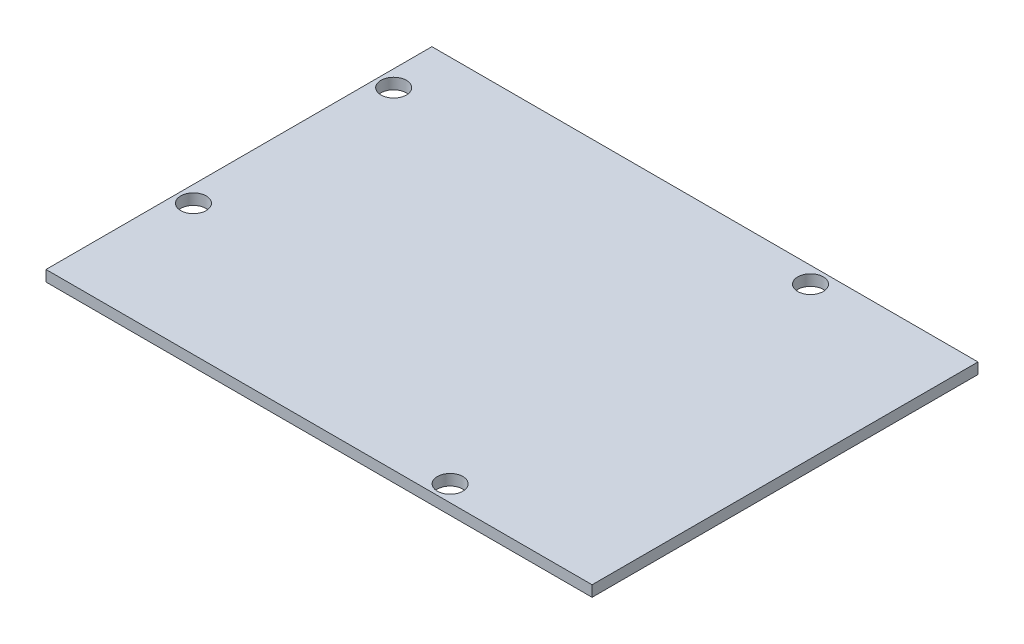
ISO-10303-21;
HEADER;
FILE_DESCRIPTION(('STEP AP214'),'2;1');
FILE_NAME('part.step','',(''),(''),'','','');
FILE_SCHEMA(('AUTOMOTIVE_DESIGN { 1 0 10303 214 1 1 1 1 }'));
ENDSEC;
DATA;
#1=APPLICATION_CONTEXT('core data for automotive mechanical design processes');
#2=APPLICATION_PROTOCOL_DEFINITION('international standard','automotive_design',2000,#1);
#3=PRODUCT_CONTEXT('',#1,'mechanical');
#4=PRODUCT('Part','Part','',(#3));
#5=PRODUCT_RELATED_PRODUCT_CATEGORY('part','',(#4));
#6=PRODUCT_DEFINITION_FORMATION('','',#4);
#7=PRODUCT_DEFINITION_CONTEXT('part definition',#1,'design');
#8=PRODUCT_DEFINITION('design','',#6,#7);
#9=PRODUCT_DEFINITION_SHAPE('','',#8);
#10=(LENGTH_UNIT() NAMED_UNIT(*) SI_UNIT(.MILLI.,.METRE.));
#11=(NAMED_UNIT(*) PLANE_ANGLE_UNIT() SI_UNIT($,.RADIAN.));
#12=(NAMED_UNIT(*) SI_UNIT($,.STERADIAN.) SOLID_ANGLE_UNIT());
#13=UNCERTAINTY_MEASURE_WITH_UNIT(LENGTH_MEASURE(1.E-05),#10,'distance_accuracy_value','');
#14=(GEOMETRIC_REPRESENTATION_CONTEXT(3) GLOBAL_UNCERTAINTY_ASSIGNED_CONTEXT((#13)) GLOBAL_UNIT_ASSIGNED_CONTEXT((#10,
#11,#12)) REPRESENTATION_CONTEXT('',''));
#15=CARTESIAN_POINT('',(0.,0.,0.));
#16=DIRECTION('',(0.,0.,1.));
#17=DIRECTION('',(1.,0.,0.));
#18=AXIS2_PLACEMENT_3D('',#15,#16,#17);
#19=CARTESIAN_POINT('',(0.,1.5,0.));
#20=DIRECTION('',(0.,1.,0.));
#21=DIRECTION('',(0.,0.,1.));
#22=AXIS2_PLACEMENT_3D('',#19,#20,#21);
#23=PLANE('',#22);
#24=CARTESIAN_POINT('',(15.75,1.5,24.25));
#25=DIRECTION('',(0.,1.,0.));
#26=DIRECTION('',(0.,0.,1.));
#27=AXIS2_PLACEMENT_3D('',#24,#25,#26);
#28=CIRCLE('',#27,1.75);
#29=CARTESIAN_POINT('',(15.75,1.5,26.));
#30=VERTEX_POINT('',#29);
#31=EDGE_CURVE('E127',#30,#30,#28,.T.);
#32=ORIENTED_EDGE('',*,*,#31,.F.);
#33=EDGE_LOOP('',(#32));
#34=FACE_BOUND('',#33,.T.);
#35=CARTESIAN_POINT('',(-35.25,1.5,-19.));
#36=DIRECTION('',(0.,1.,0.));
#37=DIRECTION('',(0.,0.,1.));
#38=AXIS2_PLACEMENT_3D('',#35,#36,#37);
#39=CIRCLE('',#38,1.75);
#40=CARTESIAN_POINT('',(-35.25,1.5,-17.25));
#41=VERTEX_POINT('',#40);
#42=EDGE_CURVE('E106',#41,#41,#39,.T.);
#43=ORIENTED_EDGE('',*,*,#42,.F.);
#44=EDGE_LOOP('',(#43));
#45=FACE_BOUND('',#44,.T.);
#46=DIRECTION('',(0.,0.,1.));
#47=VECTOR('',#46,1.);
#48=CARTESIAN_POINT('',(-37.5,1.5,26.5));
#49=LINE('',#48,#47);
#50=CARTESIAN_POINT('',(-37.5,1.5,-26.5));
#51=VERTEX_POINT('',#50);
#52=CARTESIAN_POINT('',(-37.5,1.5,26.5));
#53=VERTEX_POINT('',#52);
#54=EDGE_CURVE('E91',#51,#53,#49,.T.);
#55=ORIENTED_EDGE('',*,*,#54,.T.);
#56=DIRECTION('',(1.,0.,0.));
#57=VECTOR('',#56,1.);
#58=CARTESIAN_POINT('',(37.5,1.5,26.5));
#59=LINE('',#58,#57);
#60=CARTESIAN_POINT('',(37.5,1.5,26.5));
#61=VERTEX_POINT('',#60);
#62=EDGE_CURVE('E86',#53,#61,#59,.T.);
#63=ORIENTED_EDGE('',*,*,#62,.T.);
#64=DIRECTION('',(0.,0.,-1.));
#65=VECTOR('',#64,1.);
#66=CARTESIAN_POINT('',(37.5,1.5,26.5));
#67=LINE('',#66,#65);
#68=CARTESIAN_POINT('',(37.5,1.5,-26.5));
#69=VERTEX_POINT('',#68);
#70=EDGE_CURVE('E89',#61,#69,#67,.T.);
#71=ORIENTED_EDGE('',*,*,#70,.T.);
#72=DIRECTION('',(-1.,0.,0.));
#73=VECTOR('',#72,1.);
#74=CARTESIAN_POINT('',(37.5,1.5,-26.5));
#75=LINE('',#74,#73);
#76=EDGE_CURVE('E56',#69,#51,#75,.T.);
#77=ORIENTED_EDGE('',*,*,#76,.T.);
#78=EDGE_LOOP('',(#55,#63,#71,#77));
#79=FACE_BOUND('',#78,.T.);
#80=CARTESIAN_POINT('',(-35.25,1.5,8.50000000000001));
#81=DIRECTION('',(0.,1.,0.));
#82=DIRECTION('',(0.,0.,1.));
#83=AXIS2_PLACEMENT_3D('',#80,#81,#82);
#84=CIRCLE('',#83,1.75);
#85=CARTESIAN_POINT('',(-35.25,1.5,10.25));
#86=VERTEX_POINT('',#85);
#87=EDGE_CURVE('E121',#86,#86,#84,.T.);
#88=ORIENTED_EDGE('',*,*,#87,.F.);
#89=EDGE_LOOP('',(#88));
#90=FACE_BOUND('',#89,.T.);
#91=CARTESIAN_POINT('',(16.75,1.5,-24.25));
#92=DIRECTION('',(0.,1.,0.));
#93=DIRECTION('',(0.,0.,1.));
#94=AXIS2_PLACEMENT_3D('',#91,#92,#93);
#95=CIRCLE('',#94,1.75);
#96=CARTESIAN_POINT('',(16.75,1.5,-22.5));
#97=VERTEX_POINT('',#96);
#98=EDGE_CURVE('E133',#97,#97,#95,.T.);
#99=ORIENTED_EDGE('',*,*,#98,.F.);
#100=EDGE_LOOP('',(#99));
#101=FACE_BOUND('',#100,.T.);
#102=ADVANCED_FACE('F39',(#34,#45,#79,#90,#101),#23,.T.);
#103=CARTESIAN_POINT('',(0.,0.,0.));
#104=DIRECTION('',(0.,1.,0.));
#105=DIRECTION('',(0.,0.,1.));
#106=AXIS2_PLACEMENT_3D('',#103,#104,#105);
#107=PLANE('',#106);
#108=DIRECTION('',(0.,0.,1.));
#109=VECTOR('',#108,1.);
#110=CARTESIAN_POINT('',(-37.5,0.,26.5));
#111=LINE('',#110,#109);
#112=CARTESIAN_POINT('',(-37.5,0.,-26.5));
#113=VERTEX_POINT('',#112);
#114=CARTESIAN_POINT('',(-37.5,0.,26.5));
#115=VERTEX_POINT('',#114);
#116=EDGE_CURVE('E103',#113,#115,#111,.T.);
#117=ORIENTED_EDGE('',*,*,#116,.F.);
#118=DIRECTION('',(-1.,0.,0.));
#119=VECTOR('',#118,1.);
#120=CARTESIAN_POINT('',(37.5,0.,-26.5));
#121=LINE('',#120,#119);
#122=CARTESIAN_POINT('',(37.5,0.,-26.5));
#123=VERTEX_POINT('',#122);
#124=EDGE_CURVE('E79',#123,#113,#121,.T.);
#125=ORIENTED_EDGE('',*,*,#124,.F.);
#126=DIRECTION('',(0.,0.,-1.));
#127=VECTOR('',#126,1.);
#128=CARTESIAN_POINT('',(37.5,0.,26.5));
#129=LINE('',#128,#127);
#130=CARTESIAN_POINT('',(37.5,0.,26.5));
#131=VERTEX_POINT('',#130);
#132=EDGE_CURVE('E73',#131,#123,#129,.T.);
#133=ORIENTED_EDGE('',*,*,#132,.F.);
#134=DIRECTION('',(1.,0.,0.));
#135=VECTOR('',#134,1.);
#136=CARTESIAN_POINT('',(37.5,0.,26.5));
#137=LINE('',#136,#135);
#138=EDGE_CURVE('E95',#115,#131,#137,.T.);
#139=ORIENTED_EDGE('',*,*,#138,.F.);
#140=EDGE_LOOP('',(#117,#125,#133,#139));
#141=FACE_BOUND('',#140,.T.);
#142=CARTESIAN_POINT('',(-35.25,0.,-19.));
#143=DIRECTION('',(0.,1.,0.));
#144=DIRECTION('',(0.,0.,1.));
#145=AXIS2_PLACEMENT_3D('',#142,#143,#144);
#146=CIRCLE('',#145,1.75);
#147=CARTESIAN_POINT('',(-35.25,0.,-17.25));
#148=VERTEX_POINT('',#147);
#149=EDGE_CURVE('E118',#148,#148,#146,.T.);
#150=ORIENTED_EDGE('',*,*,#149,.T.);
#151=EDGE_LOOP('',(#150));
#152=FACE_BOUND('',#151,.T.);
#153=CARTESIAN_POINT('',(-35.25,0.,8.50000000000001));
#154=DIRECTION('',(0.,1.,0.));
#155=DIRECTION('',(0.,0.,1.));
#156=AXIS2_PLACEMENT_3D('',#153,#154,#155);
#157=CIRCLE('',#156,1.75);
#158=CARTESIAN_POINT('',(-35.25,0.,10.25));
#159=VERTEX_POINT('',#158);
#160=EDGE_CURVE('E124',#159,#159,#157,.T.);
#161=ORIENTED_EDGE('',*,*,#160,.T.);
#162=EDGE_LOOP('',(#161));
#163=FACE_BOUND('',#162,.T.);
#164=CARTESIAN_POINT('',(15.75,0.,24.25));
#165=DIRECTION('',(0.,1.,0.));
#166=DIRECTION('',(0.,0.,1.));
#167=AXIS2_PLACEMENT_3D('',#164,#165,#166);
#168=CIRCLE('',#167,1.75);
#169=CARTESIAN_POINT('',(15.75,0.,26.));
#170=VERTEX_POINT('',#169);
#171=EDGE_CURVE('E130',#170,#170,#168,.T.);
#172=ORIENTED_EDGE('',*,*,#171,.T.);
#173=EDGE_LOOP('',(#172));
#174=FACE_BOUND('',#173,.T.);
#175=CARTESIAN_POINT('',(16.75,0.,-24.25));
#176=DIRECTION('',(0.,1.,0.));
#177=DIRECTION('',(0.,0.,1.));
#178=AXIS2_PLACEMENT_3D('',#175,#176,#177);
#179=CIRCLE('',#178,1.75);
#180=CARTESIAN_POINT('',(16.75,0.,-22.5));
#181=VERTEX_POINT('',#180);
#182=EDGE_CURVE('E136',#181,#181,#179,.T.);
#183=ORIENTED_EDGE('',*,*,#182,.T.);
#184=EDGE_LOOP('',(#183));
#185=FACE_BOUND('',#184,.T.);
#186=ADVANCED_FACE('F114',(#141,#152,#163,#174,#185),#107,.F.);
#187=CARTESIAN_POINT('',(-37.5,1.5,26.5));
#188=DIRECTION('',(1.,0.,0.));
#189=DIRECTION('',(0.,0.,-1.));
#190=AXIS2_PLACEMENT_3D('',#187,#188,#189);
#191=PLANE('',#190);
#192=ORIENTED_EDGE('',*,*,#116,.T.);
#193=DIRECTION('',(0.,-1.,0.));
#194=VECTOR('',#193,1.);
#195=CARTESIAN_POINT('',(-37.5,1.5,26.5));
#196=LINE('',#195,#194);
#197=EDGE_CURVE('E11',#53,#115,#196,.T.);
#198=ORIENTED_EDGE('',*,*,#197,.F.);
#199=ORIENTED_EDGE('',*,*,#54,.F.);
#200=DIRECTION('',(0.,-1.,0.));
#201=VECTOR('',#200,1.);
#202=CARTESIAN_POINT('',(-37.5,1.5,-26.5));
#203=LINE('',#202,#201);
#204=EDGE_CURVE('E99',#51,#113,#203,.T.);
#205=ORIENTED_EDGE('',*,*,#204,.T.);
#206=EDGE_LOOP('',(#192,#198,#199,#205));
#207=FACE_BOUND('',#206,.T.);
#208=ADVANCED_FACE('F41',(#207),#191,.F.);
#209=CARTESIAN_POINT('',(37.5,1.5,26.5));
#210=DIRECTION('',(0.,0.,-1.));
#211=DIRECTION('',(-1.,0.,0.));
#212=AXIS2_PLACEMENT_3D('',#209,#210,#211);
#213=PLANE('',#212);
#214=ORIENTED_EDGE('',*,*,#138,.T.);
#215=DIRECTION('',(0.,-1.,0.));
#216=VECTOR('',#215,1.);
#217=CARTESIAN_POINT('',(37.5,1.5,26.5));
#218=LINE('',#217,#216);
#219=EDGE_CURVE('E48',#61,#131,#218,.T.);
#220=ORIENTED_EDGE('',*,*,#219,.F.);
#221=ORIENTED_EDGE('',*,*,#62,.F.);
#222=ORIENTED_EDGE('',*,*,#197,.T.);
#223=EDGE_LOOP('',(#214,#220,#221,#222));
#224=FACE_BOUND('',#223,.T.);
#225=ADVANCED_FACE('F94',(#224),#213,.F.);
#226=CARTESIAN_POINT('',(37.5,1.5,26.5));
#227=DIRECTION('',(-1.,0.,0.));
#228=DIRECTION('',(0.,0.,1.));
#229=AXIS2_PLACEMENT_3D('',#226,#227,#228);
#230=PLANE('',#229);
#231=ORIENTED_EDGE('',*,*,#132,.T.);
#232=DIRECTION('',(0.,-1.,0.));
#233=VECTOR('',#232,1.);
#234=CARTESIAN_POINT('',(37.5,1.5,-26.5));
#235=LINE('',#234,#233);
#236=EDGE_CURVE('E96',#69,#123,#235,.T.);
#237=ORIENTED_EDGE('',*,*,#236,.F.);
#238=ORIENTED_EDGE('',*,*,#70,.F.);
#239=ORIENTED_EDGE('',*,*,#219,.T.);
#240=EDGE_LOOP('',(#231,#237,#238,#239));
#241=FACE_BOUND('',#240,.T.);
#242=ADVANCED_FACE('F97',(#241),#230,.F.);
#243=CARTESIAN_POINT('',(37.5,1.5,-26.5));
#244=DIRECTION('',(0.,0.,1.));
#245=DIRECTION('',(1.,0.,0.));
#246=AXIS2_PLACEMENT_3D('',#243,#244,#245);
#247=PLANE('',#246);
#248=ORIENTED_EDGE('',*,*,#124,.T.);
#249=ORIENTED_EDGE('',*,*,#204,.F.);
#250=ORIENTED_EDGE('',*,*,#76,.F.);
#251=ORIENTED_EDGE('',*,*,#236,.T.);
#252=EDGE_LOOP('',(#248,#249,#250,#251));
#253=FACE_BOUND('',#252,.T.);
#254=ADVANCED_FACE('F111',(#253),#247,.F.);
#255=CARTESIAN_POINT('',(-35.25,1.5,-19.));
#256=DIRECTION('',(0.,-1.,0.));
#257=DIRECTION('',(0.,0.,-1.));
#258=AXIS2_PLACEMENT_3D('',#255,#256,#257);
#259=CYLINDRICAL_SURFACE('',#258,1.75);
#260=ORIENTED_EDGE('',*,*,#42,.T.);
#261=EDGE_LOOP('',(#260));
#262=FACE_BOUND('',#261,.T.);
#263=ORIENTED_EDGE('',*,*,#149,.F.);
#264=EDGE_LOOP('',(#263));
#265=FACE_BOUND('',#264,.T.);
#266=ADVANCED_FACE('F155',(#262,#265),#259,.F.);
#267=CARTESIAN_POINT('',(-35.25,1.5,8.50000000000001));
#268=DIRECTION('',(0.,-1.,0.));
#269=DIRECTION('',(0.,0.,-1.));
#270=AXIS2_PLACEMENT_3D('',#267,#268,#269);
#271=CYLINDRICAL_SURFACE('',#270,1.75);
#272=ORIENTED_EDGE('',*,*,#87,.T.);
#273=EDGE_LOOP('',(#272));
#274=FACE_BOUND('',#273,.T.);
#275=ORIENTED_EDGE('',*,*,#160,.F.);
#276=EDGE_LOOP('',(#275));
#277=FACE_BOUND('',#276,.T.);
#278=ADVANCED_FACE('F200',(#274,#277),#271,.F.);
#279=CARTESIAN_POINT('',(15.75,1.5,24.25));
#280=DIRECTION('',(0.,-1.,0.));
#281=DIRECTION('',(0.,0.,-1.));
#282=AXIS2_PLACEMENT_3D('',#279,#280,#281);
#283=CYLINDRICAL_SURFACE('',#282,1.75);
#284=ORIENTED_EDGE('',*,*,#31,.T.);
#285=EDGE_LOOP('',(#284));
#286=FACE_BOUND('',#285,.T.);
#287=ORIENTED_EDGE('',*,*,#171,.F.);
#288=EDGE_LOOP('',(#287));
#289=FACE_BOUND('',#288,.T.);
#290=ADVANCED_FACE('F208',(#286,#289),#283,.F.);
#291=CARTESIAN_POINT('',(16.75,1.5,-24.25));
#292=DIRECTION('',(0.,-1.,0.));
#293=DIRECTION('',(0.,0.,-1.));
#294=AXIS2_PLACEMENT_3D('',#291,#292,#293);
#295=CYLINDRICAL_SURFACE('',#294,1.75);
#296=ORIENTED_EDGE('',*,*,#98,.T.);
#297=EDGE_LOOP('',(#296));
#298=FACE_BOUND('',#297,.T.);
#299=ORIENTED_EDGE('',*,*,#182,.F.);
#300=EDGE_LOOP('',(#299));
#301=FACE_BOUND('',#300,.T.);
#302=ADVANCED_FACE('F142',(#298,#301),#295,.F.);
#303=CLOSED_SHELL('',(#102,#186,#208,#225,#242,#254,#266,#278,#290,#302));
#304=MANIFOLD_SOLID_BREP('B2',#303);
#305=ADVANCED_BREP_SHAPE_REPRESENTATION('',(#18,#304),#14);
#306=SHAPE_DEFINITION_REPRESENTATION(#9,#305);
ENDSEC;
END-ISO-10303-21;
